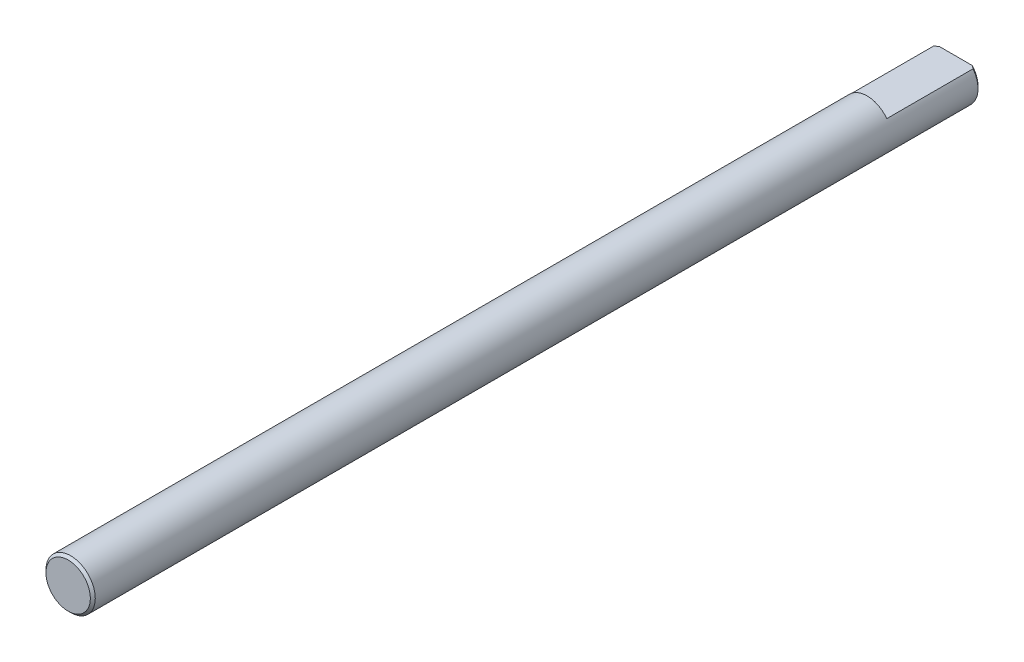
ISO-10303-21;
HEADER;
FILE_DESCRIPTION(('STEP AP214'),'2;1');
FILE_NAME('part.step','',(''),(''),'','','');
FILE_SCHEMA(('AUTOMOTIVE_DESIGN { 1 0 10303 214 1 1 1 1 }'));
ENDSEC;
DATA;
#1=APPLICATION_CONTEXT('core data for automotive mechanical design processes');
#2=APPLICATION_PROTOCOL_DEFINITION('international standard','automotive_design',2000,#1);
#3=PRODUCT_CONTEXT('',#1,'mechanical');
#4=PRODUCT('Part','Part','',(#3));
#5=PRODUCT_RELATED_PRODUCT_CATEGORY('part','',(#4));
#6=PRODUCT_DEFINITION_FORMATION('','',#4);
#7=PRODUCT_DEFINITION_CONTEXT('part definition',#1,'design');
#8=PRODUCT_DEFINITION('design','',#6,#7);
#9=PRODUCT_DEFINITION_SHAPE('','',#8);
#10=(LENGTH_UNIT() NAMED_UNIT(*) SI_UNIT(.MILLI.,.METRE.));
#11=(NAMED_UNIT(*) PLANE_ANGLE_UNIT() SI_UNIT($,.RADIAN.));
#12=(NAMED_UNIT(*) SI_UNIT($,.STERADIAN.) SOLID_ANGLE_UNIT());
#13=UNCERTAINTY_MEASURE_WITH_UNIT(LENGTH_MEASURE(1.E-05),#10,'distance_accuracy_value','');
#14=(GEOMETRIC_REPRESENTATION_CONTEXT(3) GLOBAL_UNCERTAINTY_ASSIGNED_CONTEXT((#13)) GLOBAL_UNIT_ASSIGNED_CONTEXT((#10,
#11,#12)) REPRESENTATION_CONTEXT('',''));
#15=CARTESIAN_POINT('',(0.,0.,0.));
#16=DIRECTION('',(0.,0.,1.));
#17=DIRECTION('',(1.,0.,0.));
#18=AXIS2_PLACEMENT_3D('',#15,#16,#17);
#19=CARTESIAN_POINT('',(0.,0.,-90.));
#20=DIRECTION('',(0.,0.,1.));
#21=DIRECTION('',(1.,0.,0.));
#22=AXIS2_PLACEMENT_3D('',#19,#20,#21);
#23=CYLINDRICAL_SURFACE('',#22,2.5);
#24=DIRECTION('',(0.,0.,-1.));
#25=VECTOR('',#24,1.);
#26=CARTESIAN_POINT('',(2.,1.5,-81.));
#27=LINE('',#26,#25);
#28=CARTESIAN_POINT('',(2.,1.5,-81.));
#29=VERTEX_POINT('',#28);
#30=CARTESIAN_POINT('',(2.,1.5,-89.75));
#31=VERTEX_POINT('',#30);
#32=EDGE_CURVE('E81',#29,#31,#27,.T.);
#33=ORIENTED_EDGE('',*,*,#32,.F.);
#34=CARTESIAN_POINT('',(0.,0.,-81.));
#35=DIRECTION('',(0.,0.,-1.));
#36=DIRECTION('',(-1.,0.,0.));
#37=AXIS2_PLACEMENT_3D('',#34,#35,#36);
#38=CIRCLE('',#37,2.5);
#39=CARTESIAN_POINT('',(-2.,1.5,-81.));
#40=VERTEX_POINT('',#39);
#41=EDGE_CURVE('E73',#40,#29,#38,.T.);
#42=ORIENTED_EDGE('',*,*,#41,.F.);
#43=DIRECTION('',(0.,0.,-1.));
#44=VECTOR('',#43,1.);
#45=CARTESIAN_POINT('',(-2.,1.5,-81.));
#46=LINE('',#45,#44);
#47=CARTESIAN_POINT('',(-2.,1.5,-89.75));
#48=VERTEX_POINT('',#47);
#49=EDGE_CURVE('E83',#40,#48,#46,.T.);
#50=ORIENTED_EDGE('',*,*,#49,.T.);
#51=CARTESIAN_POINT('',(0.,0.,-89.75));
#52=DIRECTION('',(0.,0.,1.));
#53=DIRECTION('',(1.,0.,0.));
#54=AXIS2_PLACEMENT_3D('',#51,#52,#53);
#55=CIRCLE('',#54,2.5);
#56=EDGE_CURVE('E88',#48,#31,#55,.T.);
#57=ORIENTED_EDGE('',*,*,#56,.T.);
#58=EDGE_LOOP('',(#33,#42,#50,#57));
#59=FACE_BOUND('',#58,.T.);
#60=CARTESIAN_POINT('',(0.,0.,-0.249999999999986));
#61=DIRECTION('',(0.,0.,1.));
#62=DIRECTION('',(1.,0.,0.));
#63=AXIS2_PLACEMENT_3D('',#60,#61,#62);
#64=CIRCLE('',#63,2.5);
#65=CARTESIAN_POINT('',(2.5,0.,-0.249999999999986));
#66=VERTEX_POINT('',#65);
#67=EDGE_CURVE('E97',#66,#66,#64,.F.);
#68=ORIENTED_EDGE('',*,*,#67,.T.);
#69=EDGE_LOOP('',(#68));
#70=FACE_BOUND('',#69,.T.);
#71=ADVANCED_FACE('F35',(#59,#70),#23,.T.);
#72=CARTESIAN_POINT('',(0.,0.,-90.));
#73=DIRECTION('',(0.,0.,1.));
#74=DIRECTION('',(1.,0.,0.));
#75=AXIS2_PLACEMENT_3D('',#72,#73,#74);
#76=PLANE('',#75);
#77=CARTESIAN_POINT('',(0.,0.,-90.));
#78=DIRECTION('',(0.,0.,1.));
#79=DIRECTION('',(1.,0.,0.));
#80=AXIS2_PLACEMENT_3D('',#77,#78,#79);
#81=CIRCLE('',#80,2.24999999999996);
#82=CARTESIAN_POINT('',(1.67705098312479,1.5,-90.));
#83=VERTEX_POINT('',#82);
#84=CARTESIAN_POINT('',(-1.67705098312479,1.5,-90.));
#85=VERTEX_POINT('',#84);
#86=EDGE_CURVE('E99',#83,#85,#81,.F.);
#87=ORIENTED_EDGE('',*,*,#86,.T.);
#88=DIRECTION('',(-1.,0.,0.));
#89=VECTOR('',#88,1.);
#90=CARTESIAN_POINT('',(2.,1.5,-90.));
#91=LINE('',#90,#89);
#92=EDGE_CURVE('E56',#83,#85,#91,.T.);
#93=ORIENTED_EDGE('',*,*,#92,.F.);
#94=EDGE_LOOP('',(#87,#93));
#95=FACE_BOUND('',#94,.T.);
#96=ADVANCED_FACE('F103',(#95),#76,.F.);
#97=CARTESIAN_POINT('',(0.,0.,0.));
#98=DIRECTION('',(0.,0.,1.));
#99=DIRECTION('',(1.,0.,0.));
#100=AXIS2_PLACEMENT_3D('',#97,#98,#99);
#101=PLANE('',#100);
#102=CARTESIAN_POINT('',(0.,0.,0.));
#103=DIRECTION('',(0.,0.,1.));
#104=DIRECTION('',(1.,0.,0.));
#105=AXIS2_PLACEMENT_3D('',#102,#103,#104);
#106=CIRCLE('',#105,2.25);
#107=CARTESIAN_POINT('',(2.25,0.,0.));
#108=VERTEX_POINT('',#107);
#109=EDGE_CURVE('E90',#108,#108,#106,.T.);
#110=ORIENTED_EDGE('',*,*,#109,.T.);
#111=EDGE_LOOP('',(#110));
#112=FACE_BOUND('',#111,.T.);
#113=ADVANCED_FACE('F111',(#112),#101,.T.);
#114=CARTESIAN_POINT('',(0.,0.,0.));
#115=DIRECTION('',(0.,0.,-1.));
#116=DIRECTION('',(-1.,0.,0.));
#117=AXIS2_PLACEMENT_3D('',#114,#115,#116);
#118=CONICAL_SURFACE('',#117,2.25,0.785398163397472);
#119=ORIENTED_EDGE('',*,*,#67,.F.);
#120=EDGE_LOOP('',(#119));
#121=FACE_BOUND('',#120,.T.);
#122=ORIENTED_EDGE('',*,*,#109,.F.);
#123=EDGE_LOOP('',(#122));
#124=FACE_BOUND('',#123,.T.);
#125=ADVANCED_FACE('F106',(#121,#124),#118,.T.);
#126=CARTESIAN_POINT('',(0.,0.,-89.75));
#127=DIRECTION('',(0.,0.,1.));
#128=DIRECTION('',(1.,0.,0.));
#129=AXIS2_PLACEMENT_3D('',#126,#127,#128);
#130=CONICAL_SURFACE('',#129,2.5,0.785398163397472);
#131=CARTESIAN_POINT('',(2.0007,1.5,-89.7494399647279));
#132=CARTESIAN_POINT('',(1.95859393868779,1.5,-89.7831260688326));
#133=CARTESIAN_POINT('',(1.91630464250837,1.5,-89.816582678012));
#134=CARTESIAN_POINT('',(1.83129225564823,1.5,-89.8829504165818));
#135=CARTESIAN_POINT('',(1.78856911328452,1.5,-89.9158614797237));
#136=CARTESIAN_POINT('',(1.65937153938278,1.5,-90.0138556785308));
#137=CARTESIAN_POINT('',(1.5721539360368,1.5,-90.0779699060401));
#138=CARTESIAN_POINT('',(1.39192692369889,1.5,-90.2047122637149));
#139=CARTESIAN_POINT('',(1.29882192178746,1.5,-90.267205398081));
#140=CARTESIAN_POINT('',(1.10888955361883,1.5,-90.3860980160845));
#141=CARTESIAN_POINT('',(1.01206798267598,1.5,-90.4425065029559));
#142=CARTESIAN_POINT('',(0.865968230159594,1.5,-90.5184323611737));
#143=CARTESIAN_POINT('',(0.818641699550773,1.5,-90.5416766284919));
#144=CARTESIAN_POINT('',(0.722775998490449,1.5,-90.5854954014342));
#145=CARTESIAN_POINT('',(0.674236665147006,1.5,-90.6060695461095));
#146=CARTESIAN_POINT('',(0.527342399899794,1.5,-90.66254727548));
#147=CARTESIAN_POINT('',(0.426950505508939,1.5,-90.6936233012383));
#148=CARTESIAN_POINT('',(0.281486050388442,1.5,-90.7244027799884));
#149=CARTESIAN_POINT('',(0.238008334729573,1.5,-90.7318553160456));
#150=CARTESIAN_POINT('',(0.150588585943515,1.5,-90.7430814513136));
#151=CARTESIAN_POINT('',(0.106646797068246,1.5,-90.7468568969757));
#152=CARTESIAN_POINT('',(0.0186563678356639,1.5,-90.7505274298453));
#153=CARTESIAN_POINT('',(-0.0253920650447845,1.5,-90.7504274549828));
#154=CARTESIAN_POINT('',(-0.113311919066666,1.5,-90.7463677909465));
#155=CARTESIAN_POINT('',(-0.157183317103864,1.5,-90.742407613369));
#156=CARTESIAN_POINT('',(-0.254655587912178,1.5,-90.7294725668032));
#157=CARTESIAN_POINT('',(-0.3081296485735,1.5,-90.7195407271245));
#158=CARTESIAN_POINT('',(-0.413938748411688,1.5,-90.694785479066));
#159=CARTESIAN_POINT('',(-0.466273107496108,1.5,-90.6799592309397));
#160=CARTESIAN_POINT('',(-0.570209267750379,1.5,-90.6460377240205));
#161=CARTESIAN_POINT('',(-0.621794957071667,1.5,-90.626893796535));
#162=CARTESIAN_POINT('',(-0.72356619277187,1.5,-90.5852502725983));
#163=CARTESIAN_POINT('',(-0.773751949066296,1.5,-90.5627511824889));
#164=CARTESIAN_POINT('',(-0.877965370261664,1.5,-90.5126102500614));
#165=CARTESIAN_POINT('',(-0.931851743585416,1.5,-90.4846770514601));
#166=CARTESIAN_POINT('',(-1.03823809211202,1.5,-90.4262765621839));
#167=CARTESIAN_POINT('',(-1.09073768467986,1.5,-90.3958085815485));
#168=CARTESIAN_POINT('',(-1.24664072204405,1.5,-90.3013536103843));
#169=CARTESIAN_POINT('',(-1.34825066607674,1.5,-90.2344158720548));
#170=CARTESIAN_POINT('',(-1.54303887214243,1.5,-90.0991061671941));
#171=CARTESIAN_POINT('',(-1.63638520536297,1.5,-90.0309708128976));
#172=CARTESIAN_POINT('',(-1.77445937548071,1.5,-89.9266813318569));
#173=CARTESIAN_POINT('',(-1.82004850236555,1.5,-89.891660410844));
#174=CARTESIAN_POINT('',(-1.91072784512969,1.5,-89.8209924999388));
#175=CARTESIAN_POINT('',(-1.95581813796383,1.5,-89.7853456088732));
#176=CARTESIAN_POINT('',(-2.0007,1.5,-89.7494399647279));
#177=B_SPLINE_CURVE_WITH_KNOTS('',3,(#131,#132,#133,#134,#135,#136,#137,#138,#139,#140,#141,
#142,#143,#144,#145,#146,#147,#148,#149,#150,#151,#152,#153,#154,#155,#156,#157,#158,#159,#160,
#161,#162,#163,#164,#165,#166,#167,#168,#169,#170,#171,#172,#173,#174,#175,#176),.UNSPECIFIED.,
.F.,.F.,(4,2,2,2,2,2,2,2,2,2,2,2,2,2,2,2,2,2,2,2,2,2,4),(0.,0.161766421728023,0.323552345781985,
0.648222323344692,0.984495285065316,1.32026364561919,1.47836493179763,1.63648756798588,
1.95014434419443,2.08235221012005,2.21449365356498,2.34646673237726,2.47845651095797,
2.6413476146045,2.80433339462505,2.96925733249519,3.13415640614282,3.3161559012971,
3.4982050993113,3.86296668179062,4.20960011626697,4.38205813590485,4.55448916876147),.UNSPECIFIED.);
#178=EDGE_CURVE('E11',#31,#83,#177,.T.);
#179=ORIENTED_EDGE('',*,*,#178,.F.);
#180=ORIENTED_EDGE('',*,*,#56,.F.);
#181=EDGE_CURVE('E41',#85,#48,#177,.T.);
#182=ORIENTED_EDGE('',*,*,#181,.F.);
#183=ORIENTED_EDGE('',*,*,#86,.F.);
#184=EDGE_LOOP('',(#179,#180,#182,#183));
#185=FACE_BOUND('',#184,.T.);
#186=ADVANCED_FACE('F38',(#185),#130,.T.);
#187=CARTESIAN_POINT('',(2.,1.5,-81.));
#188=DIRECTION('',(0.,-1.,0.));
#189=DIRECTION('',(0.,0.,-1.));
#190=AXIS2_PLACEMENT_3D('',#187,#188,#189);
#191=PLANE('',#190);
#192=ORIENTED_EDGE('',*,*,#178,.T.);
#193=ORIENTED_EDGE('',*,*,#92,.T.);
#194=ORIENTED_EDGE('',*,*,#181,.T.);
#195=ORIENTED_EDGE('',*,*,#49,.F.);
#196=DIRECTION('',(-1.,0.,0.));
#197=VECTOR('',#196,1.);
#198=CARTESIAN_POINT('',(2.,1.5,-81.));
#199=LINE('',#198,#197);
#200=EDGE_CURVE('E76',#29,#40,#199,.T.);
#201=ORIENTED_EDGE('',*,*,#200,.F.);
#202=ORIENTED_EDGE('',*,*,#32,.T.);
#203=EDGE_LOOP('',(#192,#193,#194,#195,#201,#202));
#204=FACE_BOUND('',#203,.T.);
#205=ADVANCED_FACE('F80',(#204),#191,.F.);
#206=CARTESIAN_POINT('',(0.,0.,-81.));
#207=DIRECTION('',(0.,0.,-1.));
#208=DIRECTION('',(-1.,0.,0.));
#209=AXIS2_PLACEMENT_3D('',#206,#207,#208);
#210=PLANE('',#209);
#211=ORIENTED_EDGE('',*,*,#41,.T.);
#212=ORIENTED_EDGE('',*,*,#200,.T.);
#213=EDGE_LOOP('',(#211,#212));
#214=FACE_BOUND('',#213,.T.);
#215=ADVANCED_FACE('F75',(#214),#210,.T.);
#216=CLOSED_SHELL('',(#71,#96,#113,#125,#186,#205,#215));
#217=MANIFOLD_SOLID_BREP('B2',#216);
#218=ADVANCED_BREP_SHAPE_REPRESENTATION('',(#18,#217),#14);
#219=SHAPE_DEFINITION_REPRESENTATION(#9,#218);
ENDSEC;
END-ISO-10303-21;
